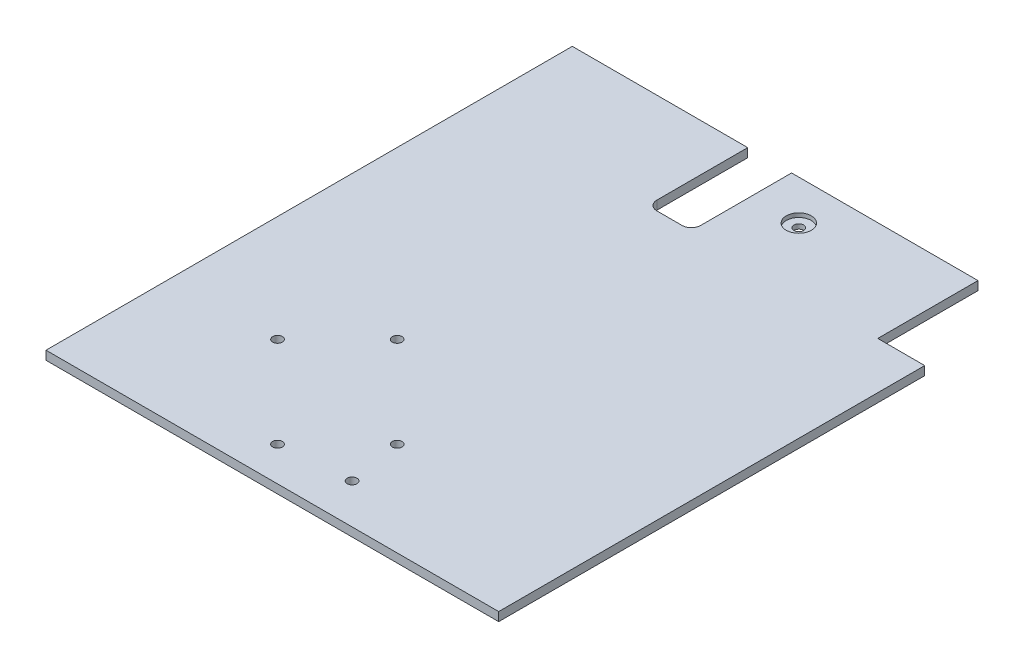
ISO-10303-21;
HEADER;
FILE_DESCRIPTION(('STEP AP214'),'2;1');
FILE_NAME('part.step','',(''),(''),'','','');
FILE_SCHEMA(('AUTOMOTIVE_DESIGN { 1 0 10303 214 1 1 1 1 }'));
ENDSEC;
DATA;
#1=APPLICATION_CONTEXT('core data for automotive mechanical design processes');
#2=APPLICATION_PROTOCOL_DEFINITION('international standard','automotive_design',2000,#1);
#3=PRODUCT_CONTEXT('',#1,'mechanical');
#4=PRODUCT('Part','Part','',(#3));
#5=PRODUCT_RELATED_PRODUCT_CATEGORY('part','',(#4));
#6=PRODUCT_DEFINITION_FORMATION('','',#4);
#7=PRODUCT_DEFINITION_CONTEXT('part definition',#1,'design');
#8=PRODUCT_DEFINITION('design','',#6,#7);
#9=PRODUCT_DEFINITION_SHAPE('','',#8);
#10=(LENGTH_UNIT() NAMED_UNIT(*) SI_UNIT(.MILLI.,.METRE.));
#11=(NAMED_UNIT(*) PLANE_ANGLE_UNIT() SI_UNIT($,.RADIAN.));
#12=(NAMED_UNIT(*) SI_UNIT($,.STERADIAN.) SOLID_ANGLE_UNIT());
#13=UNCERTAINTY_MEASURE_WITH_UNIT(LENGTH_MEASURE(1.E-05),#10,'distance_accuracy_value','');
#14=(GEOMETRIC_REPRESENTATION_CONTEXT(3) GLOBAL_UNCERTAINTY_ASSIGNED_CONTEXT((#13)) GLOBAL_UNIT_ASSIGNED_CONTEXT((#10,
#11,#12)) REPRESENTATION_CONTEXT('',''));
#15=CARTESIAN_POINT('',(0.,0.,0.));
#16=DIRECTION('',(0.,0.,1.));
#17=DIRECTION('',(1.,0.,0.));
#18=AXIS2_PLACEMENT_3D('',#15,#16,#17);
#19=CARTESIAN_POINT('',(-72.25,2.8,-84.));
#20=DIRECTION('',(0.,0.,1.));
#21=DIRECTION('',(1.,0.,0.));
#22=AXIS2_PLACEMENT_3D('',#19,#20,#21);
#23=PLANE('',#22);
#24=DIRECTION('',(-1.,0.,0.));
#25=VECTOR('',#24,1.);
#26=CARTESIAN_POINT('',(-72.25,0.,-84.));
#27=LINE('',#26,#25);
#28=CARTESIAN_POINT('',(57.25,0.,-84.));
#29=VERTEX_POINT('',#28);
#30=CARTESIAN_POINT('',(-2.24999999999999,0.,-84.));
#31=VERTEX_POINT('',#30);
#32=EDGE_CURVE('E142',#29,#31,#27,.T.);
#33=ORIENTED_EDGE('',*,*,#32,.T.);
#34=DIRECTION('',(0.,1.,0.));
#35=VECTOR('',#34,1.);
#36=CARTESIAN_POINT('',(-2.24999999999999,-0.00100000000000013,-84.));
#37=LINE('',#36,#35);
#38=CARTESIAN_POINT('',(-2.24999999999999,2.8,-84.));
#39=VERTEX_POINT('',#38);
#40=EDGE_CURVE('E122',#31,#39,#37,.T.);
#41=ORIENTED_EDGE('',*,*,#40,.T.);
#42=DIRECTION('',(-1.,0.,0.));
#43=VECTOR('',#42,1.);
#44=CARTESIAN_POINT('',(-72.25,2.8,-84.));
#45=LINE('',#44,#43);
#46=CARTESIAN_POINT('',(57.25,2.8,-84.));
#47=VERTEX_POINT('',#46);
#48=EDGE_CURVE('E214',#47,#39,#45,.T.);
#49=ORIENTED_EDGE('',*,*,#48,.F.);
#50=DIRECTION('',(0.,1.,0.));
#51=VECTOR('',#50,1.);
#52=CARTESIAN_POINT('',(57.25,-0.00100000000000013,-84.));
#53=LINE('',#52,#51);
#54=EDGE_CURVE('E148',#29,#47,#53,.T.);
#55=ORIENTED_EDGE('',*,*,#54,.F.);
#56=EDGE_LOOP('',(#33,#41,#49,#55));
#57=FACE_BOUND('',#56,.T.);
#58=ADVANCED_FACE('F33',(#57),#23,.F.);
#59=CARTESIAN_POINT('',(12.75,-0.00100000000000013,-71.3));
#60=DIRECTION('',(0.,1.,0.));
#61=DIRECTION('',(0.,0.,1.));
#62=AXIS2_PLACEMENT_3D('',#59,#60,#61);
#63=CYLINDRICAL_SURFACE('',#62,1.54999999999999);
#64=CARTESIAN_POINT('',(12.75,0.,-71.3));
#65=DIRECTION('',(0.,-1.,0.));
#66=DIRECTION('',(0.,0.,-1.));
#67=AXIS2_PLACEMENT_3D('',#64,#65,#66);
#68=CIRCLE('',#67,1.54999999999999);
#69=CARTESIAN_POINT('',(12.75,0.,-72.85));
#70=VERTEX_POINT('',#69);
#71=EDGE_CURVE('E198',#70,#70,#68,.F.);
#72=ORIENTED_EDGE('',*,*,#71,.F.);
#73=EDGE_LOOP('',(#72));
#74=FACE_BOUND('',#73,.T.);
#75=CARTESIAN_POINT('',(12.75,1.5,-71.3));
#76=DIRECTION('',(0.,1.,0.));
#77=DIRECTION('',(0.,0.,1.));
#78=AXIS2_PLACEMENT_3D('',#75,#76,#77);
#79=CIRCLE('',#78,1.54999999999999);
#80=CARTESIAN_POINT('',(12.75,1.5,-69.75));
#81=VERTEX_POINT('',#80);
#82=EDGE_CURVE('E37',#81,#81,#79,.F.);
#83=ORIENTED_EDGE('',*,*,#82,.F.);
#84=EDGE_LOOP('',(#83));
#85=FACE_BOUND('',#84,.T.);
#86=ADVANCED_FACE('F297',(#74,#85),#63,.F.);
#87=CARTESIAN_POINT('',(72.25,2.8,84.));
#88=DIRECTION('',(-1.,0.,0.));
#89=DIRECTION('',(0.,0.,1.));
#90=AXIS2_PLACEMENT_3D('',#87,#88,#89);
#91=PLANE('',#90);
#92=DIRECTION('',(0.,0.,-1.));
#93=VECTOR('',#92,1.);
#94=CARTESIAN_POINT('',(72.25,0.,84.));
#95=LINE('',#94,#93);
#96=CARTESIAN_POINT('',(72.25,0.,84.));
#97=VERTEX_POINT('',#96);
#98=CARTESIAN_POINT('',(72.25,0.,-52.));
#99=VERTEX_POINT('',#98);
#100=EDGE_CURVE('E154',#97,#99,#95,.T.);
#101=ORIENTED_EDGE('',*,*,#100,.T.);
#102=DIRECTION('',(0.,1.,0.));
#103=VECTOR('',#102,1.);
#104=CARTESIAN_POINT('',(72.25,-0.00100000000000013,-52.));
#105=LINE('',#104,#103);
#106=CARTESIAN_POINT('',(72.25,2.8,-52.));
#107=VERTEX_POINT('',#106);
#108=EDGE_CURVE('E57',#99,#107,#105,.T.);
#109=ORIENTED_EDGE('',*,*,#108,.T.);
#110=DIRECTION('',(0.,0.,-1.));
#111=VECTOR('',#110,1.);
#112=CARTESIAN_POINT('',(72.25,2.8,84.));
#113=LINE('',#112,#111);
#114=CARTESIAN_POINT('',(72.25,2.8,84.));
#115=VERTEX_POINT('',#114);
#116=EDGE_CURVE('E159',#115,#107,#113,.T.);
#117=ORIENTED_EDGE('',*,*,#116,.F.);
#118=DIRECTION('',(0.,-1.,0.));
#119=VECTOR('',#118,1.);
#120=CARTESIAN_POINT('',(72.25,2.8,84.));
#121=LINE('',#120,#119);
#122=EDGE_CURVE('E160',#115,#97,#121,.T.);
#123=ORIENTED_EDGE('',*,*,#122,.T.);
#124=EDGE_LOOP('',(#101,#109,#117,#123));
#125=FACE_BOUND('',#124,.T.);
#126=ADVANCED_FACE('F35',(#125),#91,.F.);
#127=CARTESIAN_POINT('',(-16.25,2.8,-84.));
#128=VERTEX_POINT('',#127);
#129=CARTESIAN_POINT('',(-72.25,2.8,-84.));
#130=VERTEX_POINT('',#129);
#131=EDGE_CURVE('E213',#128,#130,#45,.T.);
#132=ORIENTED_EDGE('',*,*,#131,.F.);
#133=DIRECTION('',(0.,1.,0.));
#134=VECTOR('',#133,1.);
#135=CARTESIAN_POINT('',(-16.25,-0.00100000000000013,-84.));
#136=LINE('',#135,#134);
#137=CARTESIAN_POINT('',(-16.25,0.,-84.));
#138=VERTEX_POINT('',#137);
#139=EDGE_CURVE('E244',#138,#128,#136,.T.);
#140=ORIENTED_EDGE('',*,*,#139,.F.);
#141=CARTESIAN_POINT('',(-72.25,0.,-84.));
#142=VERTEX_POINT('',#141);
#143=EDGE_CURVE('E150',#138,#142,#27,.T.);
#144=ORIENTED_EDGE('',*,*,#143,.T.);
#145=DIRECTION('',(0.,-1.,0.));
#146=VECTOR('',#145,1.);
#147=CARTESIAN_POINT('',(-72.25,2.8,-84.));
#148=LINE('',#147,#146);
#149=EDGE_CURVE('E11',#130,#142,#148,.T.);
#150=ORIENTED_EDGE('',*,*,#149,.F.);
#151=EDGE_LOOP('',(#132,#140,#144,#150));
#152=FACE_BOUND('',#151,.T.);
#153=ADVANCED_FACE('F298',(#152),#23,.F.);
#154=CARTESIAN_POINT('',(-72.25,2.8,84.));
#155=DIRECTION('',(1.,0.,0.));
#156=DIRECTION('',(0.,0.,-1.));
#157=AXIS2_PLACEMENT_3D('',#154,#155,#156);
#158=PLANE('',#157);
#159=DIRECTION('',(0.,0.,1.));
#160=VECTOR('',#159,1.);
#161=CARTESIAN_POINT('',(-72.25,0.,84.));
#162=LINE('',#161,#160);
#163=CARTESIAN_POINT('',(-72.25,0.,84.));
#164=VERTEX_POINT('',#163);
#165=EDGE_CURVE('E149',#142,#164,#162,.T.);
#166=ORIENTED_EDGE('',*,*,#165,.T.);
#167=DIRECTION('',(0.,-1.,0.));
#168=VECTOR('',#167,1.);
#169=CARTESIAN_POINT('',(-72.25,2.8,84.));
#170=LINE('',#169,#168);
#171=CARTESIAN_POINT('',(-72.25,2.8,84.));
#172=VERTEX_POINT('',#171);
#173=EDGE_CURVE('E42',#172,#164,#170,.T.);
#174=ORIENTED_EDGE('',*,*,#173,.F.);
#175=DIRECTION('',(0.,0.,1.));
#176=VECTOR('',#175,1.);
#177=CARTESIAN_POINT('',(-72.25,2.8,84.));
#178=LINE('',#177,#176);
#179=EDGE_CURVE('E216',#130,#172,#178,.T.);
#180=ORIENTED_EDGE('',*,*,#179,.F.);
#181=ORIENTED_EDGE('',*,*,#149,.T.);
#182=EDGE_LOOP('',(#166,#174,#180,#181));
#183=FACE_BOUND('',#182,.T.);
#184=ADVANCED_FACE('F306',(#183),#158,.F.);
#185=CARTESIAN_POINT('',(-72.25,2.8,84.));
#186=DIRECTION('',(0.,0.,-1.));
#187=DIRECTION('',(-1.,0.,0.));
#188=AXIS2_PLACEMENT_3D('',#185,#186,#187);
#189=PLANE('',#188);
#190=DIRECTION('',(1.,0.,0.));
#191=VECTOR('',#190,1.);
#192=CARTESIAN_POINT('',(-72.25,0.,84.));
#193=LINE('',#192,#191);
#194=EDGE_CURVE('E152',#164,#97,#193,.T.);
#195=ORIENTED_EDGE('',*,*,#194,.T.);
#196=ORIENTED_EDGE('',*,*,#122,.F.);
#197=DIRECTION('',(1.,0.,0.));
#198=VECTOR('',#197,1.);
#199=CARTESIAN_POINT('',(-72.25,2.8,84.));
#200=LINE('',#199,#198);
#201=EDGE_CURVE('E163',#172,#115,#200,.T.);
#202=ORIENTED_EDGE('',*,*,#201,.F.);
#203=ORIENTED_EDGE('',*,*,#173,.T.);
#204=EDGE_LOOP('',(#195,#196,#202,#203));
#205=FACE_BOUND('',#204,.T.);
#206=ADVANCED_FACE('F169',(#205),#189,.F.);
#207=CARTESIAN_POINT('',(0.,2.8,0.));
#208=DIRECTION('',(0.,-1.,0.));
#209=DIRECTION('',(0.,0.,-1.));
#210=AXIS2_PLACEMENT_3D('',#207,#208,#209);
#211=PLANE('',#210);
#212=CARTESIAN_POINT('',(12.75,2.8,-71.3));
#213=DIRECTION('',(0.,1.,0.));
#214=DIRECTION('',(0.,0.,1.));
#215=AXIS2_PLACEMENT_3D('',#212,#213,#214);
#216=CIRCLE('',#215,4.);
#217=CARTESIAN_POINT('',(12.75,2.8,-67.3));
#218=VERTEX_POINT('',#217);
#219=EDGE_CURVE('E236',#218,#218,#216,.T.);
#220=ORIENTED_EDGE('',*,*,#219,.F.);
#221=EDGE_LOOP('',(#220));
#222=FACE_BOUND('',#221,.T.);
#223=CARTESIAN_POINT('',(12.75,2.8,71.3));
#224=DIRECTION('',(0.,1.,0.));
#225=DIRECTION('',(0.,0.,1.));
#226=AXIS2_PLACEMENT_3D('',#223,#224,#225);
#227=CIRCLE('',#226,1.54999999999999);
#228=CARTESIAN_POINT('',(12.75,2.8,72.85));
#229=VERTEX_POINT('',#228);
#230=EDGE_CURVE('E231',#229,#229,#227,.T.);
#231=ORIENTED_EDGE('',*,*,#230,.F.);
#232=EDGE_LOOP('',(#231));
#233=FACE_BOUND('',#232,.T.);
#234=CARTESIAN_POINT('',(-38.2916305603427,2.8,44.0502525316942));
#235=DIRECTION('',(0.,1.,0.));
#236=DIRECTION('',(0.,0.,1.));
#237=AXIS2_PLACEMENT_3D('',#234,#235,#236);
#238=CIRCLE('',#237,1.55);
#239=CARTESIAN_POINT('',(-38.2916305603427,2.8,45.6002525316942));
#240=VERTEX_POINT('',#239);
#241=EDGE_CURVE('E192',#240,#240,#238,.T.);
#242=ORIENTED_EDGE('',*,*,#241,.F.);
#243=EDGE_LOOP('',(#242));
#244=FACE_BOUND('',#243,.T.);
#245=CARTESIAN_POINT('',(-9.30025253169415,2.8,73.0416305603426));
#246=DIRECTION('',(0.,1.,0.));
#247=DIRECTION('',(0.,0.,1.));
#248=AXIS2_PLACEMENT_3D('',#245,#246,#247);
#249=CIRCLE('',#248,1.55);
#250=CARTESIAN_POINT('',(-9.30025253169415,2.8,74.5916305603426));
#251=VERTEX_POINT('',#250);
#252=EDGE_CURVE('E185',#251,#251,#249,.T.);
#253=ORIENTED_EDGE('',*,*,#252,.F.);
#254=EDGE_LOOP('',(#253));
#255=FACE_BOUND('',#254,.T.);
#256=CARTESIAN_POINT('',(-19.1997474683059,2.8,24.9583694396574));
#257=DIRECTION('',(0.,1.,0.));
#258=DIRECTION('',(0.,0.,1.));
#259=AXIS2_PLACEMENT_3D('',#256,#257,#258);
#260=CIRCLE('',#259,1.55);
#261=CARTESIAN_POINT('',(-19.1997474683059,2.8,26.5083694396574));
#262=VERTEX_POINT('',#261);
#263=EDGE_CURVE('E206',#262,#262,#260,.T.);
#264=ORIENTED_EDGE('',*,*,#263,.F.);
#265=EDGE_LOOP('',(#264));
#266=FACE_BOUND('',#265,.T.);
#267=CARTESIAN_POINT('',(9.79163056034259,2.8,53.9497474683058));
#268=DIRECTION('',(0.,1.,0.));
#269=DIRECTION('',(0.,0.,1.));
#270=AXIS2_PLACEMENT_3D('',#267,#268,#269);
#271=CIRCLE('',#270,1.55000000000001);
#272=CARTESIAN_POINT('',(9.79163056034259,2.8,55.4997474683058));
#273=VERTEX_POINT('',#272);
#274=EDGE_CURVE('E199',#273,#273,#271,.T.);
#275=ORIENTED_EDGE('',*,*,#274,.F.);
#276=EDGE_LOOP('',(#275));
#277=FACE_BOUND('',#276,.T.);
#278=ORIENTED_EDGE('',*,*,#48,.T.);
#279=DIRECTION('',(0.,0.,-1.));
#280=VECTOR('',#279,1.);
#281=CARTESIAN_POINT('',(-2.24999999999999,2.8,-55.));
#282=LINE('',#281,#280);
#283=CARTESIAN_POINT('',(-2.24999999999999,2.8,-55.));
#284=VERTEX_POINT('',#283);
#285=EDGE_CURVE('E128',#284,#39,#282,.T.);
#286=ORIENTED_EDGE('',*,*,#285,.F.);
#287=CARTESIAN_POINT('',(-5.24999999999999,2.8,-55.));
#288=DIRECTION('',(0.,1.,0.));
#289=DIRECTION('',(0.,0.,-1.));
#290=AXIS2_PLACEMENT_3D('',#287,#288,#289);
#291=CIRCLE('',#290,3.);
#292=CARTESIAN_POINT('',(-5.24999999999999,2.8,-52.));
#293=VERTEX_POINT('',#292);
#294=EDGE_CURVE('E253',#293,#284,#291,.T.);
#295=ORIENTED_EDGE('',*,*,#294,.F.);
#296=DIRECTION('',(1.,0.,0.));
#297=VECTOR('',#296,1.);
#298=CARTESIAN_POINT('',(-13.25,2.8,-52.));
#299=LINE('',#298,#297);
#300=CARTESIAN_POINT('',(-13.25,2.8,-52.));
#301=VERTEX_POINT('',#300);
#302=EDGE_CURVE('E256',#301,#293,#299,.T.);
#303=ORIENTED_EDGE('',*,*,#302,.F.);
#304=CARTESIAN_POINT('',(-13.25,2.8,-55.));
#305=DIRECTION('',(0.,1.,0.));
#306=DIRECTION('',(0.,0.,-1.));
#307=AXIS2_PLACEMENT_3D('',#304,#305,#306);
#308=CIRCLE('',#307,3.);
#309=CARTESIAN_POINT('',(-16.25,2.8,-55.));
#310=VERTEX_POINT('',#309);
#311=EDGE_CURVE('E259',#310,#301,#308,.T.);
#312=ORIENTED_EDGE('',*,*,#311,.F.);
#313=DIRECTION('',(0.,0.,1.));
#314=VECTOR('',#313,1.);
#315=CARTESIAN_POINT('',(-16.25,2.8,-84.));
#316=LINE('',#315,#314);
#317=EDGE_CURVE('E145',#128,#310,#316,.T.);
#318=ORIENTED_EDGE('',*,*,#317,.F.);
#319=ORIENTED_EDGE('',*,*,#131,.T.);
#320=ORIENTED_EDGE('',*,*,#179,.T.);
#321=ORIENTED_EDGE('',*,*,#201,.T.);
#322=ORIENTED_EDGE('',*,*,#116,.T.);
#323=DIRECTION('',(1.,0.,0.));
#324=VECTOR('',#323,1.);
#325=CARTESIAN_POINT('',(57.25,2.8,-52.));
#326=LINE('',#325,#324);
#327=CARTESIAN_POINT('',(57.25,2.8,-52.));
#328=VERTEX_POINT('',#327);
#329=EDGE_CURVE('E221',#328,#107,#326,.T.);
#330=ORIENTED_EDGE('',*,*,#329,.F.);
#331=DIRECTION('',(0.,0.,1.));
#332=VECTOR('',#331,1.);
#333=CARTESIAN_POINT('',(57.25,2.8,-84.));
#334=LINE('',#333,#332);
#335=EDGE_CURVE('E224',#47,#328,#334,.T.);
#336=ORIENTED_EDGE('',*,*,#335,.F.);
#337=EDGE_LOOP('',(#278,#286,#295,#303,#312,#318,#319,#320,#321,#322,#330,#336));
#338=FACE_BOUND('',#337,.T.);
#339=ADVANCED_FACE('F218',(#222,#233,#244,#255,#266,#277,#338),#211,.F.);
#340=CARTESIAN_POINT('',(0.,0.,0.));
#341=DIRECTION('',(0.,-1.,0.));
#342=DIRECTION('',(0.,0.,-1.));
#343=AXIS2_PLACEMENT_3D('',#340,#341,#342);
#344=PLANE('',#343);
#345=DIRECTION('',(0.,0.,-1.));
#346=VECTOR('',#345,1.);
#347=CARTESIAN_POINT('',(-2.24999999999999,0.,-55.));
#348=LINE('',#347,#346);
#349=CARTESIAN_POINT('',(-2.24999999999999,0.,-55.));
#350=VERTEX_POINT('',#349);
#351=EDGE_CURVE('E125',#350,#31,#348,.T.);
#352=ORIENTED_EDGE('',*,*,#351,.T.);
#353=ORIENTED_EDGE('',*,*,#32,.F.);
#354=DIRECTION('',(0.,0.,1.));
#355=VECTOR('',#354,1.);
#356=CARTESIAN_POINT('',(57.25,0.,-84.));
#357=LINE('',#356,#355);
#358=CARTESIAN_POINT('',(57.25,0.,-52.));
#359=VERTEX_POINT('',#358);
#360=EDGE_CURVE('E202',#29,#359,#357,.T.);
#361=ORIENTED_EDGE('',*,*,#360,.T.);
#362=DIRECTION('',(1.,0.,0.));
#363=VECTOR('',#362,1.);
#364=CARTESIAN_POINT('',(57.25,0.,-52.));
#365=LINE('',#364,#363);
#366=EDGE_CURVE('E177',#359,#99,#365,.T.);
#367=ORIENTED_EDGE('',*,*,#366,.T.);
#368=ORIENTED_EDGE('',*,*,#100,.F.);
#369=ORIENTED_EDGE('',*,*,#194,.F.);
#370=ORIENTED_EDGE('',*,*,#165,.F.);
#371=ORIENTED_EDGE('',*,*,#143,.F.);
#372=DIRECTION('',(0.,0.,1.));
#373=VECTOR('',#372,1.);
#374=CARTESIAN_POINT('',(-16.25,0.,-84.));
#375=LINE('',#374,#373);
#376=CARTESIAN_POINT('',(-16.25,0.,-55.));
#377=VERTEX_POINT('',#376);
#378=EDGE_CURVE('E133',#138,#377,#375,.T.);
#379=ORIENTED_EDGE('',*,*,#378,.T.);
#380=CARTESIAN_POINT('',(-13.25,0.,-55.));
#381=DIRECTION('',(0.,-1.,0.));
#382=DIRECTION('',(0.,0.,-1.));
#383=AXIS2_PLACEMENT_3D('',#380,#381,#382);
#384=CIRCLE('',#383,3.);
#385=CARTESIAN_POINT('',(-13.25,0.,-52.));
#386=VERTEX_POINT('',#385);
#387=EDGE_CURVE('E266',#377,#386,#384,.F.);
#388=ORIENTED_EDGE('',*,*,#387,.T.);
#389=DIRECTION('',(1.,0.,0.));
#390=VECTOR('',#389,1.);
#391=CARTESIAN_POINT('',(-13.25,0.,-52.));
#392=LINE('',#391,#390);
#393=CARTESIAN_POINT('',(-5.24999999999999,0.,-52.));
#394=VERTEX_POINT('',#393);
#395=EDGE_CURVE('E264',#386,#394,#392,.T.);
#396=ORIENTED_EDGE('',*,*,#395,.T.);
#397=CARTESIAN_POINT('',(-5.24999999999999,0.,-55.));
#398=DIRECTION('',(0.,-1.,0.));
#399=DIRECTION('',(0.,0.,-1.));
#400=AXIS2_PLACEMENT_3D('',#397,#398,#399);
#401=CIRCLE('',#400,3.);
#402=EDGE_CURVE('E144',#394,#350,#401,.F.);
#403=ORIENTED_EDGE('',*,*,#402,.T.);
#404=EDGE_LOOP('',(#352,#353,#361,#367,#368,#369,#370,#371,#379,#388,#396,#403));
#405=FACE_BOUND('',#404,.T.);
#406=ORIENTED_EDGE('',*,*,#71,.T.);
#407=EDGE_LOOP('',(#406));
#408=FACE_BOUND('',#407,.T.);
#409=CARTESIAN_POINT('',(12.75,0.,71.3));
#410=DIRECTION('',(0.,-1.,0.));
#411=DIRECTION('',(0.,0.,-1.));
#412=AXIS2_PLACEMENT_3D('',#409,#410,#411);
#413=CIRCLE('',#412,1.54999999999999);
#414=CARTESIAN_POINT('',(12.75,0.,69.75));
#415=VERTEX_POINT('',#414);
#416=EDGE_CURVE('E228',#415,#415,#413,.F.);
#417=ORIENTED_EDGE('',*,*,#416,.T.);
#418=EDGE_LOOP('',(#417));
#419=FACE_BOUND('',#418,.T.);
#420=CARTESIAN_POINT('',(-38.2916305603427,0.,44.0502525316942));
#421=DIRECTION('',(0.,-1.,0.));
#422=DIRECTION('',(0.,0.,-1.));
#423=AXIS2_PLACEMENT_3D('',#420,#421,#422);
#424=CIRCLE('',#423,1.55);
#425=CARTESIAN_POINT('',(-38.2916305603427,0.,42.5002525316942));
#426=VERTEX_POINT('',#425);
#427=EDGE_CURVE('E195',#426,#426,#424,.F.);
#428=ORIENTED_EDGE('',*,*,#427,.T.);
#429=EDGE_LOOP('',(#428));
#430=FACE_BOUND('',#429,.T.);
#431=CARTESIAN_POINT('',(-9.30025253169415,0.,73.0416305603426));
#432=DIRECTION('',(0.,-1.,0.));
#433=DIRECTION('',(0.,0.,-1.));
#434=AXIS2_PLACEMENT_3D('',#431,#432,#433);
#435=CIRCLE('',#434,1.55);
#436=CARTESIAN_POINT('',(-9.30025253169415,0.,71.4916305603426));
#437=VERTEX_POINT('',#436);
#438=EDGE_CURVE('E189',#437,#437,#435,.F.);
#439=ORIENTED_EDGE('',*,*,#438,.T.);
#440=EDGE_LOOP('',(#439));
#441=FACE_BOUND('',#440,.T.);
#442=CARTESIAN_POINT('',(-19.1997474683059,0.,24.9583694396574));
#443=DIRECTION('',(0.,-1.,0.));
#444=DIRECTION('',(0.,0.,-1.));
#445=AXIS2_PLACEMENT_3D('',#442,#443,#444);
#446=CIRCLE('',#445,1.55);
#447=CARTESIAN_POINT('',(-19.1997474683059,0.,23.4083694396574));
#448=VERTEX_POINT('',#447);
#449=EDGE_CURVE('E188',#448,#448,#446,.F.);
#450=ORIENTED_EDGE('',*,*,#449,.T.);
#451=EDGE_LOOP('',(#450));
#452=FACE_BOUND('',#451,.T.);
#453=CARTESIAN_POINT('',(9.79163056034259,0.,53.9497474683058));
#454=DIRECTION('',(0.,-1.,0.));
#455=DIRECTION('',(0.,0.,-1.));
#456=AXIS2_PLACEMENT_3D('',#453,#454,#455);
#457=CIRCLE('',#456,1.55000000000001);
#458=CARTESIAN_POINT('',(9.79163056034259,0.,52.3997474683058));
#459=VERTEX_POINT('',#458);
#460=EDGE_CURVE('E203',#459,#459,#457,.F.);
#461=ORIENTED_EDGE('',*,*,#460,.T.);
#462=EDGE_LOOP('',(#461));
#463=FACE_BOUND('',#462,.T.);
#464=ADVANCED_FACE('F139',(#405,#408,#419,#430,#441,#452,#463),#344,.T.);
#465=CARTESIAN_POINT('',(9.79163056034259,-0.00100000000000013,53.9497474683058));
#466=DIRECTION('',(0.,1.,0.));
#467=DIRECTION('',(0.,0.,1.));
#468=AXIS2_PLACEMENT_3D('',#465,#466,#467);
#469=CYLINDRICAL_SURFACE('',#468,1.55000000000001);
#470=ORIENTED_EDGE('',*,*,#460,.F.);
#471=EDGE_LOOP('',(#470));
#472=FACE_BOUND('',#471,.T.);
#473=ORIENTED_EDGE('',*,*,#274,.T.);
#474=EDGE_LOOP('',(#473));
#475=FACE_BOUND('',#474,.T.);
#476=ADVANCED_FACE('F352',(#472,#475),#469,.F.);
#477=CARTESIAN_POINT('',(-19.1997474683059,-0.00100000000000013,24.9583694396574));
#478=DIRECTION('',(0.,1.,0.));
#479=DIRECTION('',(0.,0.,1.));
#480=AXIS2_PLACEMENT_3D('',#477,#478,#479);
#481=CYLINDRICAL_SURFACE('',#480,1.55);
#482=ORIENTED_EDGE('',*,*,#449,.F.);
#483=EDGE_LOOP('',(#482));
#484=FACE_BOUND('',#483,.T.);
#485=ORIENTED_EDGE('',*,*,#263,.T.);
#486=EDGE_LOOP('',(#485));
#487=FACE_BOUND('',#486,.T.);
#488=ADVANCED_FACE('F354',(#484,#487),#481,.F.);
#489=CARTESIAN_POINT('',(-9.30025253169415,-0.00100000000000013,73.0416305603426));
#490=DIRECTION('',(0.,1.,0.));
#491=DIRECTION('',(0.,0.,1.));
#492=AXIS2_PLACEMENT_3D('',#489,#490,#491);
#493=CYLINDRICAL_SURFACE('',#492,1.55);
#494=ORIENTED_EDGE('',*,*,#438,.F.);
#495=EDGE_LOOP('',(#494));
#496=FACE_BOUND('',#495,.T.);
#497=ORIENTED_EDGE('',*,*,#252,.T.);
#498=EDGE_LOOP('',(#497));
#499=FACE_BOUND('',#498,.T.);
#500=ADVANCED_FACE('F361',(#496,#499),#493,.F.);
#501=CARTESIAN_POINT('',(-38.2916305603427,-0.00100000000000013,44.0502525316942));
#502=DIRECTION('',(0.,1.,0.));
#503=DIRECTION('',(0.,0.,1.));
#504=AXIS2_PLACEMENT_3D('',#501,#502,#503);
#505=CYLINDRICAL_SURFACE('',#504,1.55);
#506=ORIENTED_EDGE('',*,*,#427,.F.);
#507=EDGE_LOOP('',(#506));
#508=FACE_BOUND('',#507,.T.);
#509=ORIENTED_EDGE('',*,*,#241,.T.);
#510=EDGE_LOOP('',(#509));
#511=FACE_BOUND('',#510,.T.);
#512=ADVANCED_FACE('F294',(#508,#511),#505,.F.);
#513=CARTESIAN_POINT('',(57.25,-0.00100000000000013,-84.));
#514=DIRECTION('',(-1.,0.,0.));
#515=DIRECTION('',(0.,0.,1.));
#516=AXIS2_PLACEMENT_3D('',#513,#514,#515);
#517=PLANE('',#516);
#518=ORIENTED_EDGE('',*,*,#54,.T.);
#519=ORIENTED_EDGE('',*,*,#335,.T.);
#520=DIRECTION('',(0.,1.,0.));
#521=VECTOR('',#520,1.);
#522=CARTESIAN_POINT('',(57.25,-0.00100000000000013,-52.));
#523=LINE('',#522,#521);
#524=EDGE_CURVE('E183',#359,#328,#523,.T.);
#525=ORIENTED_EDGE('',*,*,#524,.F.);
#526=ORIENTED_EDGE('',*,*,#360,.F.);
#527=EDGE_LOOP('',(#518,#519,#525,#526));
#528=FACE_BOUND('',#527,.T.);
#529=ADVANCED_FACE('F282',(#528),#517,.F.);
#530=CARTESIAN_POINT('',(57.25,-0.00100000000000013,-52.));
#531=DIRECTION('',(0.,0.,1.));
#532=DIRECTION('',(1.,0.,0.));
#533=AXIS2_PLACEMENT_3D('',#530,#531,#532);
#534=PLANE('',#533);
#535=ORIENTED_EDGE('',*,*,#524,.T.);
#536=ORIENTED_EDGE('',*,*,#329,.T.);
#537=ORIENTED_EDGE('',*,*,#108,.F.);
#538=ORIENTED_EDGE('',*,*,#366,.F.);
#539=EDGE_LOOP('',(#535,#536,#537,#538));
#540=FACE_BOUND('',#539,.T.);
#541=ADVANCED_FACE('F283',(#540),#534,.F.);
#542=CARTESIAN_POINT('',(12.75,-0.00100000000000013,71.3));
#543=DIRECTION('',(0.,1.,0.));
#544=DIRECTION('',(0.,0.,1.));
#545=AXIS2_PLACEMENT_3D('',#542,#543,#544);
#546=CYLINDRICAL_SURFACE('',#545,1.54999999999999);
#547=ORIENTED_EDGE('',*,*,#416,.F.);
#548=EDGE_LOOP('',(#547));
#549=FACE_BOUND('',#548,.T.);
#550=ORIENTED_EDGE('',*,*,#230,.T.);
#551=EDGE_LOOP('',(#550));
#552=FACE_BOUND('',#551,.T.);
#553=ADVANCED_FACE('F285',(#549,#552),#546,.F.);
#554=CARTESIAN_POINT('',(12.75,1.5,-71.3));
#555=DIRECTION('',(0.,1.,0.));
#556=DIRECTION('',(0.,0.,1.));
#557=AXIS2_PLACEMENT_3D('',#554,#555,#556);
#558=PLANE('',#557);
#559=CARTESIAN_POINT('',(12.75,1.5,-71.3));
#560=DIRECTION('',(0.,1.,0.));
#561=DIRECTION('',(0.,0.,1.));
#562=AXIS2_PLACEMENT_3D('',#559,#560,#561);
#563=CIRCLE('',#562,4.);
#564=CARTESIAN_POINT('',(12.75,1.5,-67.3));
#565=VERTEX_POINT('',#564);
#566=EDGE_CURVE('E239',#565,#565,#563,.T.);
#567=ORIENTED_EDGE('',*,*,#566,.T.);
#568=EDGE_LOOP('',(#567));
#569=FACE_BOUND('',#568,.T.);
#570=ORIENTED_EDGE('',*,*,#82,.T.);
#571=EDGE_LOOP('',(#570));
#572=FACE_BOUND('',#571,.T.);
#573=ADVANCED_FACE('F291',(#569,#572),#558,.T.);
#574=CARTESIAN_POINT('',(12.75,1.5,-71.3));
#575=DIRECTION('',(0.,1.,0.));
#576=DIRECTION('',(0.,0.,1.));
#577=AXIS2_PLACEMENT_3D('',#574,#575,#576);
#578=CYLINDRICAL_SURFACE('',#577,4.);
#579=ORIENTED_EDGE('',*,*,#566,.F.);
#580=EDGE_LOOP('',(#579));
#581=FACE_BOUND('',#580,.T.);
#582=ORIENTED_EDGE('',*,*,#219,.T.);
#583=EDGE_LOOP('',(#582));
#584=FACE_BOUND('',#583,.T.);
#585=ADVANCED_FACE('F327',(#581,#584),#578,.F.);
#586=CARTESIAN_POINT('',(-2.24999999999999,-0.00100000000000013,-55.));
#587=DIRECTION('',(1.,0.,0.));
#588=DIRECTION('',(0.,0.,-1.));
#589=AXIS2_PLACEMENT_3D('',#586,#587,#588);
#590=PLANE('',#589);
#591=DIRECTION('',(0.,1.,0.));
#592=VECTOR('',#591,1.);
#593=CARTESIAN_POINT('',(-2.24999999999999,-0.00100000000000013,-55.));
#594=LINE('',#593,#592);
#595=EDGE_CURVE('E134',#350,#284,#594,.T.);
#596=ORIENTED_EDGE('',*,*,#595,.T.);
#597=ORIENTED_EDGE('',*,*,#285,.T.);
#598=ORIENTED_EDGE('',*,*,#40,.F.);
#599=ORIENTED_EDGE('',*,*,#351,.F.);
#600=EDGE_LOOP('',(#596,#597,#598,#599));
#601=FACE_BOUND('',#600,.T.);
#602=ADVANCED_FACE('F124',(#601),#590,.F.);
#603=CARTESIAN_POINT('',(-5.24999999999999,-0.00100000000000013,-55.));
#604=DIRECTION('',(0.,1.,0.));
#605=DIRECTION('',(0.,0.,1.));
#606=AXIS2_PLACEMENT_3D('',#603,#604,#605);
#607=CYLINDRICAL_SURFACE('',#606,3.);
#608=DIRECTION('',(0.,1.,0.));
#609=VECTOR('',#608,1.);
#610=CARTESIAN_POINT('',(-5.24999999999999,-0.00100000000000013,-52.));
#611=LINE('',#610,#609);
#612=EDGE_CURVE('E249',#394,#293,#611,.T.);
#613=ORIENTED_EDGE('',*,*,#612,.T.);
#614=ORIENTED_EDGE('',*,*,#294,.T.);
#615=ORIENTED_EDGE('',*,*,#595,.F.);
#616=ORIENTED_EDGE('',*,*,#402,.F.);
#617=EDGE_LOOP('',(#613,#614,#615,#616));
#618=FACE_BOUND('',#617,.T.);
#619=ADVANCED_FACE('F278',(#618),#607,.F.);
#620=CARTESIAN_POINT('',(-13.25,-0.00100000000000013,-52.));
#621=DIRECTION('',(0.,0.,1.));
#622=DIRECTION('',(1.,0.,0.));
#623=AXIS2_PLACEMENT_3D('',#620,#621,#622);
#624=PLANE('',#623);
#625=DIRECTION('',(0.,1.,0.));
#626=VECTOR('',#625,1.);
#627=CARTESIAN_POINT('',(-13.25,-0.00100000000000013,-52.));
#628=LINE('',#627,#626);
#629=EDGE_CURVE('E247',#386,#301,#628,.T.);
#630=ORIENTED_EDGE('',*,*,#629,.T.);
#631=ORIENTED_EDGE('',*,*,#302,.T.);
#632=ORIENTED_EDGE('',*,*,#612,.F.);
#633=ORIENTED_EDGE('',*,*,#395,.F.);
#634=EDGE_LOOP('',(#630,#631,#632,#633));
#635=FACE_BOUND('',#634,.T.);
#636=ADVANCED_FACE('F274',(#635),#624,.F.);
#637=CARTESIAN_POINT('',(-13.25,-0.00100000000000013,-55.));
#638=DIRECTION('',(0.,1.,0.));
#639=DIRECTION('',(0.,0.,1.));
#640=AXIS2_PLACEMENT_3D('',#637,#638,#639);
#641=CYLINDRICAL_SURFACE('',#640,3.);
#642=DIRECTION('',(0.,1.,0.));
#643=VECTOR('',#642,1.);
#644=CARTESIAN_POINT('',(-16.25,-0.00100000000000013,-55.));
#645=LINE('',#644,#643);
#646=EDGE_CURVE('E49',#377,#310,#645,.T.);
#647=ORIENTED_EDGE('',*,*,#646,.T.);
#648=ORIENTED_EDGE('',*,*,#311,.T.);
#649=ORIENTED_EDGE('',*,*,#629,.F.);
#650=ORIENTED_EDGE('',*,*,#387,.F.);
#651=EDGE_LOOP('',(#647,#648,#649,#650));
#652=FACE_BOUND('',#651,.T.);
#653=ADVANCED_FACE('F270',(#652),#641,.F.);
#654=CARTESIAN_POINT('',(-16.25,-0.00100000000000013,-84.));
#655=DIRECTION('',(-1.,0.,0.));
#656=DIRECTION('',(0.,0.,1.));
#657=AXIS2_PLACEMENT_3D('',#654,#655,#656);
#658=PLANE('',#657);
#659=ORIENTED_EDGE('',*,*,#139,.T.);
#660=ORIENTED_EDGE('',*,*,#317,.T.);
#661=ORIENTED_EDGE('',*,*,#646,.F.);
#662=ORIENTED_EDGE('',*,*,#378,.F.);
#663=EDGE_LOOP('',(#659,#660,#661,#662));
#664=FACE_BOUND('',#663,.T.);
#665=ADVANCED_FACE('F316',(#664),#658,.F.);
#666=CLOSED_SHELL('',(#58,#86,#126,#153,#184,#206,#339,#464,#476,#488,#500,#512,#529,#541,#553,
#573,#585,#602,#619,#636,#653,#665));
#667=MANIFOLD_SOLID_BREP('B2',#666);
#668=ADVANCED_BREP_SHAPE_REPRESENTATION('',(#18,#667),#14);
#669=SHAPE_DEFINITION_REPRESENTATION(#9,#668);
ENDSEC;
END-ISO-10303-21;
